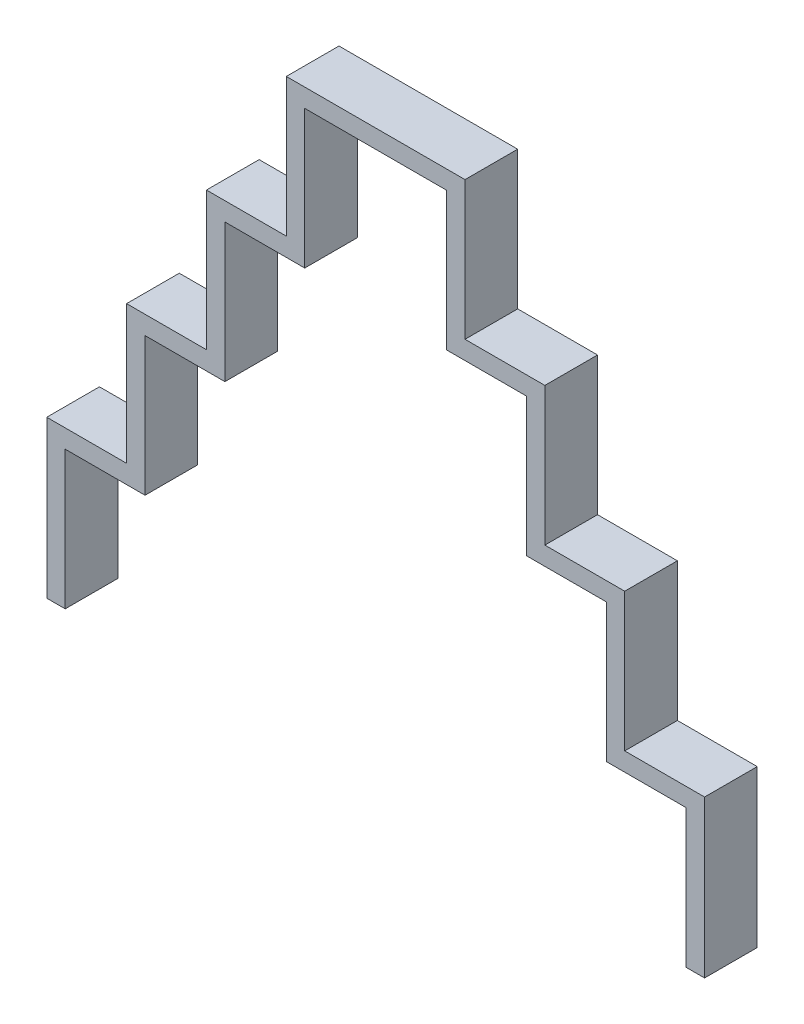
ISO-10303-21;
HEADER;
FILE_DESCRIPTION(('STEP AP214'),'2;1');
FILE_NAME('part.step','',(''),(''),'','','');
FILE_SCHEMA(('AUTOMOTIVE_DESIGN { 1 0 10303 214 1 1 1 1 }'));
ENDSEC;
DATA;
#1=APPLICATION_CONTEXT('core data for automotive mechanical design processes');
#2=APPLICATION_PROTOCOL_DEFINITION('international standard','automotive_design',2000,#1);
#3=PRODUCT_CONTEXT('',#1,'mechanical');
#4=PRODUCT('Part','Part','',(#3));
#5=PRODUCT_RELATED_PRODUCT_CATEGORY('part','',(#4));
#6=PRODUCT_DEFINITION_FORMATION('','',#4);
#7=PRODUCT_DEFINITION_CONTEXT('part definition',#1,'design');
#8=PRODUCT_DEFINITION('design','',#6,#7);
#9=PRODUCT_DEFINITION_SHAPE('','',#8);
#10=(LENGTH_UNIT() NAMED_UNIT(*) SI_UNIT(.MILLI.,.METRE.));
#11=(NAMED_UNIT(*) PLANE_ANGLE_UNIT() SI_UNIT($,.RADIAN.));
#12=(NAMED_UNIT(*) SI_UNIT($,.STERADIAN.) SOLID_ANGLE_UNIT());
#13=UNCERTAINTY_MEASURE_WITH_UNIT(LENGTH_MEASURE(1.E-05),#10,'distance_accuracy_value','');
#14=(GEOMETRIC_REPRESENTATION_CONTEXT(3) GLOBAL_UNCERTAINTY_ASSIGNED_CONTEXT((#13)) GLOBAL_UNIT_ASSIGNED_CONTEXT((#10,
#11,#12)) REPRESENTATION_CONTEXT('',''));
#15=CARTESIAN_POINT('',(0.,0.,0.));
#16=DIRECTION('',(0.,0.,1.));
#17=DIRECTION('',(1.,0.,0.));
#18=AXIS2_PLACEMENT_3D('',#15,#16,#17);
#19=CARTESIAN_POINT('',(-12.485,0.,2.));
#20=DIRECTION('',(0.,1.,0.));
#21=DIRECTION('',(0.,0.,1.));
#22=AXIS2_PLACEMENT_3D('',#19,#20,#21);
#23=PLANE('',#22);
#24=DIRECTION('',(1.,0.,0.));
#25=VECTOR('',#24,1.);
#26=CARTESIAN_POINT('',(-12.485,0.,0.));
#27=LINE('',#26,#25);
#28=CARTESIAN_POINT('',(-12.485,0.,0.));
#29=VERTEX_POINT('',#28);
#30=CARTESIAN_POINT('',(-11.785,0.,0.));
#31=VERTEX_POINT('',#30);
#32=EDGE_CURVE('E275',#29,#31,#27,.T.);
#33=ORIENTED_EDGE('',*,*,#32,.T.);
#34=DIRECTION('',(0.,0.,-1.));
#35=VECTOR('',#34,1.);
#36=CARTESIAN_POINT('',(-11.785,0.,2.));
#37=LINE('',#36,#35);
#38=CARTESIAN_POINT('',(-11.785,0.,2.));
#39=VERTEX_POINT('',#38);
#40=EDGE_CURVE('E11',#39,#31,#37,.T.);
#41=ORIENTED_EDGE('',*,*,#40,.F.);
#42=DIRECTION('',(1.,0.,0.));
#43=VECTOR('',#42,1.);
#44=CARTESIAN_POINT('',(-12.485,0.,2.));
#45=LINE('',#44,#43);
#46=CARTESIAN_POINT('',(-12.485,0.,2.));
#47=VERTEX_POINT('',#46);
#48=EDGE_CURVE('E337',#47,#39,#45,.T.);
#49=ORIENTED_EDGE('',*,*,#48,.F.);
#50=DIRECTION('',(0.,0.,-1.));
#51=VECTOR('',#50,1.);
#52=CARTESIAN_POINT('',(-12.485,0.,2.));
#53=LINE('',#52,#51);
#54=EDGE_CURVE('E271',#47,#29,#53,.T.);
#55=ORIENTED_EDGE('',*,*,#54,.T.);
#56=EDGE_LOOP('',(#33,#41,#49,#55));
#57=FACE_BOUND('',#56,.T.);
#58=ADVANCED_FACE('F35',(#57),#23,.F.);
#59=CARTESIAN_POINT('',(-11.785,5.25,2.));
#60=DIRECTION('',(-1.,0.,0.));
#61=DIRECTION('',(0.,0.,1.));
#62=AXIS2_PLACEMENT_3D('',#59,#60,#61);
#63=PLANE('',#62);
#64=DIRECTION('',(0.,1.,0.));
#65=VECTOR('',#64,1.);
#66=CARTESIAN_POINT('',(-11.785,5.25,0.));
#67=LINE('',#66,#65);
#68=CARTESIAN_POINT('',(-11.785,5.25,0.));
#69=VERTEX_POINT('',#68);
#70=EDGE_CURVE('E278',#31,#69,#67,.T.);
#71=ORIENTED_EDGE('',*,*,#70,.T.);
#72=DIRECTION('',(0.,0.,-1.));
#73=VECTOR('',#72,1.);
#74=CARTESIAN_POINT('',(-11.785,5.25,2.));
#75=LINE('',#74,#73);
#76=CARTESIAN_POINT('',(-11.785,5.25,2.));
#77=VERTEX_POINT('',#76);
#78=EDGE_CURVE('E43',#77,#69,#75,.T.);
#79=ORIENTED_EDGE('',*,*,#78,.F.);
#80=DIRECTION('',(0.,1.,0.));
#81=VECTOR('',#80,1.);
#82=CARTESIAN_POINT('',(-11.785,5.25,2.));
#83=LINE('',#82,#81);
#84=EDGE_CURVE('E166',#39,#77,#83,.T.);
#85=ORIENTED_EDGE('',*,*,#84,.F.);
#86=ORIENTED_EDGE('',*,*,#40,.T.);
#87=EDGE_LOOP('',(#71,#79,#85,#86));
#88=FACE_BOUND('',#87,.T.);
#89=ADVANCED_FACE('F515',(#88),#63,.F.);
#90=CARTESIAN_POINT('',(-8.75391108675444,5.25,2.));
#91=DIRECTION('',(0.,1.,0.));
#92=DIRECTION('',(-1.,0.,0.));
#93=AXIS2_PLACEMENT_3D('',#90,#91,#92);
#94=PLANE('',#93);
#95=DIRECTION('',(1.,0.,0.));
#96=VECTOR('',#95,1.);
#97=CARTESIAN_POINT('',(-8.75391108675444,5.25,0.));
#98=LINE('',#97,#96);
#99=CARTESIAN_POINT('',(-8.75391108675444,5.25,0.));
#100=VERTEX_POINT('',#99);
#101=EDGE_CURVE('E280',#69,#100,#98,.T.);
#102=ORIENTED_EDGE('',*,*,#101,.T.);
#103=DIRECTION('',(0.,0.,-1.));
#104=VECTOR('',#103,1.);
#105=CARTESIAN_POINT('',(-8.75391108675444,5.25,2.));
#106=LINE('',#105,#104);
#107=CARTESIAN_POINT('',(-8.75391108675444,5.25,2.));
#108=VERTEX_POINT('',#107);
#109=EDGE_CURVE('E416',#108,#100,#106,.T.);
#110=ORIENTED_EDGE('',*,*,#109,.F.);
#111=DIRECTION('',(1.,0.,0.));
#112=VECTOR('',#111,1.);
#113=CARTESIAN_POINT('',(-8.75391108675444,5.25,2.));
#114=LINE('',#113,#112);
#115=EDGE_CURVE('E424',#77,#108,#114,.T.);
#116=ORIENTED_EDGE('',*,*,#115,.F.);
#117=ORIENTED_EDGE('',*,*,#78,.T.);
#118=EDGE_LOOP('',(#102,#110,#116,#117));
#119=FACE_BOUND('',#118,.T.);
#120=ADVANCED_FACE('F422',(#119),#94,.F.);
#121=CARTESIAN_POINT('',(-8.75391108675444,10.5,2.));
#122=DIRECTION('',(-1.,0.,0.));
#123=DIRECTION('',(0.,-1.,0.));
#124=AXIS2_PLACEMENT_3D('',#121,#122,#123);
#125=PLANE('',#124);
#126=DIRECTION('',(0.,1.,0.));
#127=VECTOR('',#126,1.);
#128=CARTESIAN_POINT('',(-8.75391108675444,10.5,0.));
#129=LINE('',#128,#127);
#130=CARTESIAN_POINT('',(-8.75391108675444,10.5,0.));
#131=VERTEX_POINT('',#130);
#132=EDGE_CURVE('E282',#100,#131,#129,.T.);
#133=ORIENTED_EDGE('',*,*,#132,.T.);
#134=DIRECTION('',(0.,0.,-1.));
#135=VECTOR('',#134,1.);
#136=CARTESIAN_POINT('',(-8.75391108675444,10.5,2.));
#137=LINE('',#136,#135);
#138=CARTESIAN_POINT('',(-8.75391108675444,10.5,2.));
#139=VERTEX_POINT('',#138);
#140=EDGE_CURVE('E413',#139,#131,#137,.T.);
#141=ORIENTED_EDGE('',*,*,#140,.F.);
#142=DIRECTION('',(0.,1.,0.));
#143=VECTOR('',#142,1.);
#144=CARTESIAN_POINT('',(-8.75391108675444,10.5,2.));
#145=LINE('',#144,#143);
#146=EDGE_CURVE('E442',#108,#139,#145,.T.);
#147=ORIENTED_EDGE('',*,*,#146,.F.);
#148=ORIENTED_EDGE('',*,*,#109,.T.);
#149=EDGE_LOOP('',(#133,#141,#147,#148));
#150=FACE_BOUND('',#149,.T.);
#151=ADVANCED_FACE('F433',(#150),#125,.F.);
#152=CARTESIAN_POINT('',(-5.72282217350887,10.5,2.));
#153=DIRECTION('',(0.,1.,0.));
#154=DIRECTION('',(0.,0.,1.));
#155=AXIS2_PLACEMENT_3D('',#152,#153,#154);
#156=PLANE('',#155);
#157=DIRECTION('',(1.,0.,0.));
#158=VECTOR('',#157,1.);
#159=CARTESIAN_POINT('',(-5.72282217350887,10.5,0.));
#160=LINE('',#159,#158);
#161=CARTESIAN_POINT('',(-5.72282217350887,10.5,0.));
#162=VERTEX_POINT('',#161);
#163=EDGE_CURVE('E284',#131,#162,#160,.T.);
#164=ORIENTED_EDGE('',*,*,#163,.T.);
#165=DIRECTION('',(0.,0.,-1.));
#166=VECTOR('',#165,1.);
#167=CARTESIAN_POINT('',(-5.72282217350887,10.5,2.));
#168=LINE('',#167,#166);
#169=CARTESIAN_POINT('',(-5.72282217350887,10.5,2.));
#170=VERTEX_POINT('',#169);
#171=EDGE_CURVE('E410',#170,#162,#168,.T.);
#172=ORIENTED_EDGE('',*,*,#171,.F.);
#173=DIRECTION('',(1.,0.,0.));
#174=VECTOR('',#173,1.);
#175=CARTESIAN_POINT('',(-5.72282217350887,10.5,2.));
#176=LINE('',#175,#174);
#177=EDGE_CURVE('E439',#139,#170,#176,.T.);
#178=ORIENTED_EDGE('',*,*,#177,.F.);
#179=ORIENTED_EDGE('',*,*,#140,.T.);
#180=EDGE_LOOP('',(#164,#172,#178,#179));
#181=FACE_BOUND('',#180,.T.);
#182=ADVANCED_FACE('F437',(#181),#156,.F.);
#183=CARTESIAN_POINT('',(-5.72282217350887,15.75,2.));
#184=DIRECTION('',(-1.,0.,0.));
#185=DIRECTION('',(0.,0.,1.));
#186=AXIS2_PLACEMENT_3D('',#183,#184,#185);
#187=PLANE('',#186);
#188=DIRECTION('',(0.,1.,0.));
#189=VECTOR('',#188,1.);
#190=CARTESIAN_POINT('',(-5.72282217350887,15.75,0.));
#191=LINE('',#190,#189);
#192=CARTESIAN_POINT('',(-5.72282217350887,15.75,0.));
#193=VERTEX_POINT('',#192);
#194=EDGE_CURVE('E286',#162,#193,#191,.T.);
#195=ORIENTED_EDGE('',*,*,#194,.T.);
#196=DIRECTION('',(0.,0.,-1.));
#197=VECTOR('',#196,1.);
#198=CARTESIAN_POINT('',(-5.72282217350887,15.75,2.));
#199=LINE('',#198,#197);
#200=CARTESIAN_POINT('',(-5.72282217350887,15.75,2.));
#201=VERTEX_POINT('',#200);
#202=EDGE_CURVE('E407',#201,#193,#199,.T.);
#203=ORIENTED_EDGE('',*,*,#202,.F.);
#204=DIRECTION('',(0.,1.,0.));
#205=VECTOR('',#204,1.);
#206=CARTESIAN_POINT('',(-5.72282217350887,15.75,2.));
#207=LINE('',#206,#205);
#208=EDGE_CURVE('E441',#170,#201,#207,.T.);
#209=ORIENTED_EDGE('',*,*,#208,.F.);
#210=ORIENTED_EDGE('',*,*,#171,.T.);
#211=EDGE_LOOP('',(#195,#203,#209,#210));
#212=FACE_BOUND('',#211,.T.);
#213=ADVANCED_FACE('F528',(#212),#187,.F.);
#214=CARTESIAN_POINT('',(-2.6917332602633,15.75,2.));
#215=DIRECTION('',(0.,1.,0.));
#216=DIRECTION('',(0.,0.,1.));
#217=AXIS2_PLACEMENT_3D('',#214,#215,#216);
#218=PLANE('',#217);
#219=DIRECTION('',(1.,0.,0.));
#220=VECTOR('',#219,1.);
#221=CARTESIAN_POINT('',(-2.6917332602633,15.75,0.));
#222=LINE('',#221,#220);
#223=CARTESIAN_POINT('',(-2.6917332602633,15.75,0.));
#224=VERTEX_POINT('',#223);
#225=EDGE_CURVE('E288',#193,#224,#222,.T.);
#226=ORIENTED_EDGE('',*,*,#225,.T.);
#227=DIRECTION('',(0.,0.,-1.));
#228=VECTOR('',#227,1.);
#229=CARTESIAN_POINT('',(-2.6917332602633,15.75,2.));
#230=LINE('',#229,#228);
#231=CARTESIAN_POINT('',(-2.6917332602633,15.75,2.));
#232=VERTEX_POINT('',#231);
#233=EDGE_CURVE('E404',#232,#224,#230,.T.);
#234=ORIENTED_EDGE('',*,*,#233,.F.);
#235=DIRECTION('',(1.,0.,0.));
#236=VECTOR('',#235,1.);
#237=CARTESIAN_POINT('',(-2.6917332602633,15.75,2.));
#238=LINE('',#237,#236);
#239=EDGE_CURVE('E444',#201,#232,#238,.T.);
#240=ORIENTED_EDGE('',*,*,#239,.F.);
#241=ORIENTED_EDGE('',*,*,#202,.T.);
#242=EDGE_LOOP('',(#226,#234,#240,#241));
#243=FACE_BOUND('',#242,.T.);
#244=ADVANCED_FACE('F531',(#243),#218,.F.);
#245=CARTESIAN_POINT('',(-2.6917332602633,21.,2.));
#246=DIRECTION('',(-1.,0.,0.));
#247=DIRECTION('',(0.,-1.,0.));
#248=AXIS2_PLACEMENT_3D('',#245,#246,#247);
#249=PLANE('',#248);
#250=DIRECTION('',(0.,1.,0.));
#251=VECTOR('',#250,1.);
#252=CARTESIAN_POINT('',(-2.6917332602633,21.,0.));
#253=LINE('',#252,#251);
#254=CARTESIAN_POINT('',(-2.6917332602633,21.,0.));
#255=VERTEX_POINT('',#254);
#256=EDGE_CURVE('E290',#224,#255,#253,.T.);
#257=ORIENTED_EDGE('',*,*,#256,.T.);
#258=DIRECTION('',(0.,0.,-1.));
#259=VECTOR('',#258,1.);
#260=CARTESIAN_POINT('',(-2.6917332602633,21.,2.));
#261=LINE('',#260,#259);
#262=CARTESIAN_POINT('',(-2.6917332602633,21.,2.));
#263=VERTEX_POINT('',#262);
#264=EDGE_CURVE('E401',#263,#255,#261,.T.);
#265=ORIENTED_EDGE('',*,*,#264,.F.);
#266=DIRECTION('',(0.,1.,0.));
#267=VECTOR('',#266,1.);
#268=CARTESIAN_POINT('',(-2.6917332602633,21.,2.));
#269=LINE('',#268,#267);
#270=EDGE_CURVE('E450',#232,#263,#269,.T.);
#271=ORIENTED_EDGE('',*,*,#270,.F.);
#272=ORIENTED_EDGE('',*,*,#233,.T.);
#273=EDGE_LOOP('',(#257,#265,#271,#272));
#274=FACE_BOUND('',#273,.T.);
#275=ADVANCED_FACE('F535',(#274),#249,.F.);
#276=CARTESIAN_POINT('',(-2.6917332602633,21.,2.));
#277=DIRECTION('',(0.,1.,0.));
#278=DIRECTION('',(0.,0.,1.));
#279=AXIS2_PLACEMENT_3D('',#276,#277,#278);
#280=PLANE('',#279);
#281=DIRECTION('',(1.,0.,0.));
#282=VECTOR('',#281,1.);
#283=CARTESIAN_POINT('',(-2.6917332602633,21.,0.));
#284=LINE('',#283,#282);
#285=CARTESIAN_POINT('',(2.6917332602633,21.,0.));
#286=VERTEX_POINT('',#285);
#287=EDGE_CURVE('E292',#255,#286,#284,.T.);
#288=ORIENTED_EDGE('',*,*,#287,.T.);
#289=DIRECTION('',(0.,0.,-1.));
#290=VECTOR('',#289,1.);
#291=CARTESIAN_POINT('',(2.6917332602633,21.,2.));
#292=LINE('',#291,#290);
#293=CARTESIAN_POINT('',(2.6917332602633,21.,2.));
#294=VERTEX_POINT('',#293);
#295=EDGE_CURVE('E398',#294,#286,#292,.T.);
#296=ORIENTED_EDGE('',*,*,#295,.F.);
#297=DIRECTION('',(1.,0.,0.));
#298=VECTOR('',#297,1.);
#299=CARTESIAN_POINT('',(-2.6917332602633,21.,2.));
#300=LINE('',#299,#298);
#301=EDGE_CURVE('E452',#263,#294,#300,.T.);
#302=ORIENTED_EDGE('',*,*,#301,.F.);
#303=ORIENTED_EDGE('',*,*,#264,.T.);
#304=EDGE_LOOP('',(#288,#296,#302,#303));
#305=FACE_BOUND('',#304,.T.);
#306=ADVANCED_FACE('F539',(#305),#280,.F.);
#307=CARTESIAN_POINT('',(2.6917332602633,21.,2.));
#308=DIRECTION('',(1.,0.,0.));
#309=DIRECTION('',(0.,1.,0.));
#310=AXIS2_PLACEMENT_3D('',#307,#308,#309);
#311=PLANE('',#310);
#312=DIRECTION('',(0.,-1.,0.));
#313=VECTOR('',#312,1.);
#314=CARTESIAN_POINT('',(2.6917332602633,21.,0.));
#315=LINE('',#314,#313);
#316=CARTESIAN_POINT('',(2.6917332602633,15.75,0.));
#317=VERTEX_POINT('',#316);
#318=EDGE_CURVE('E294',#286,#317,#315,.T.);
#319=ORIENTED_EDGE('',*,*,#318,.T.);
#320=DIRECTION('',(0.,0.,-1.));
#321=VECTOR('',#320,1.);
#322=CARTESIAN_POINT('',(2.6917332602633,15.75,2.));
#323=LINE('',#322,#321);
#324=CARTESIAN_POINT('',(2.6917332602633,15.75,2.));
#325=VERTEX_POINT('',#324);
#326=EDGE_CURVE('E395',#325,#317,#323,.T.);
#327=ORIENTED_EDGE('',*,*,#326,.F.);
#328=DIRECTION('',(0.,-1.,0.));
#329=VECTOR('',#328,1.);
#330=CARTESIAN_POINT('',(2.6917332602633,21.,2.));
#331=LINE('',#330,#329);
#332=EDGE_CURVE('E454',#294,#325,#331,.T.);
#333=ORIENTED_EDGE('',*,*,#332,.F.);
#334=ORIENTED_EDGE('',*,*,#295,.T.);
#335=EDGE_LOOP('',(#319,#327,#333,#334));
#336=FACE_BOUND('',#335,.T.);
#337=ADVANCED_FACE('F543',(#336),#311,.F.);
#338=CARTESIAN_POINT('',(2.6917332602633,15.75,2.));
#339=DIRECTION('',(0.,1.,0.));
#340=DIRECTION('',(0.,0.,1.));
#341=AXIS2_PLACEMENT_3D('',#338,#339,#340);
#342=PLANE('',#341);
#343=DIRECTION('',(1.,0.,0.));
#344=VECTOR('',#343,1.);
#345=CARTESIAN_POINT('',(2.6917332602633,15.75,0.));
#346=LINE('',#345,#344);
#347=CARTESIAN_POINT('',(5.72282217350887,15.75,0.));
#348=VERTEX_POINT('',#347);
#349=EDGE_CURVE('E296',#317,#348,#346,.T.);
#350=ORIENTED_EDGE('',*,*,#349,.T.);
#351=DIRECTION('',(0.,0.,-1.));
#352=VECTOR('',#351,1.);
#353=CARTESIAN_POINT('',(5.72282217350887,15.75,2.));
#354=LINE('',#353,#352);
#355=CARTESIAN_POINT('',(5.72282217350887,15.75,2.));
#356=VERTEX_POINT('',#355);
#357=EDGE_CURVE('E392',#356,#348,#354,.T.);
#358=ORIENTED_EDGE('',*,*,#357,.F.);
#359=DIRECTION('',(1.,0.,0.));
#360=VECTOR('',#359,1.);
#361=CARTESIAN_POINT('',(2.6917332602633,15.75,2.));
#362=LINE('',#361,#360);
#363=EDGE_CURVE('E456',#325,#356,#362,.T.);
#364=ORIENTED_EDGE('',*,*,#363,.F.);
#365=ORIENTED_EDGE('',*,*,#326,.T.);
#366=EDGE_LOOP('',(#350,#358,#364,#365));
#367=FACE_BOUND('',#366,.T.);
#368=ADVANCED_FACE('F547',(#367),#342,.F.);
#369=CARTESIAN_POINT('',(5.72282217350887,15.75,2.));
#370=DIRECTION('',(1.,0.,0.));
#371=DIRECTION('',(0.,0.,-1.));
#372=AXIS2_PLACEMENT_3D('',#369,#370,#371);
#373=PLANE('',#372);
#374=DIRECTION('',(0.,-1.,0.));
#375=VECTOR('',#374,1.);
#376=CARTESIAN_POINT('',(5.72282217350887,15.75,0.));
#377=LINE('',#376,#375);
#378=CARTESIAN_POINT('',(5.72282217350887,10.5,0.));
#379=VERTEX_POINT('',#378);
#380=EDGE_CURVE('E298',#348,#379,#377,.T.);
#381=ORIENTED_EDGE('',*,*,#380,.T.);
#382=DIRECTION('',(0.,0.,-1.));
#383=VECTOR('',#382,1.);
#384=CARTESIAN_POINT('',(5.72282217350887,10.5,2.));
#385=LINE('',#384,#383);
#386=CARTESIAN_POINT('',(5.72282217350887,10.5,2.));
#387=VERTEX_POINT('',#386);
#388=EDGE_CURVE('E389',#387,#379,#385,.T.);
#389=ORIENTED_EDGE('',*,*,#388,.F.);
#390=DIRECTION('',(0.,-1.,0.));
#391=VECTOR('',#390,1.);
#392=CARTESIAN_POINT('',(5.72282217350887,15.75,2.));
#393=LINE('',#392,#391);
#394=EDGE_CURVE('E458',#356,#387,#393,.T.);
#395=ORIENTED_EDGE('',*,*,#394,.F.);
#396=ORIENTED_EDGE('',*,*,#357,.T.);
#397=EDGE_LOOP('',(#381,#389,#395,#396));
#398=FACE_BOUND('',#397,.T.);
#399=ADVANCED_FACE('F551',(#398),#373,.F.);
#400=CARTESIAN_POINT('',(5.72282217350887,10.5,2.));
#401=DIRECTION('',(0.,1.,0.));
#402=DIRECTION('',(0.,0.,1.));
#403=AXIS2_PLACEMENT_3D('',#400,#401,#402);
#404=PLANE('',#403);
#405=DIRECTION('',(1.,0.,0.));
#406=VECTOR('',#405,1.);
#407=CARTESIAN_POINT('',(5.72282217350887,10.5,0.));
#408=LINE('',#407,#406);
#409=CARTESIAN_POINT('',(8.75391108675444,10.5,0.));
#410=VERTEX_POINT('',#409);
#411=EDGE_CURVE('E300',#379,#410,#408,.T.);
#412=ORIENTED_EDGE('',*,*,#411,.T.);
#413=DIRECTION('',(0.,0.,-1.));
#414=VECTOR('',#413,1.);
#415=CARTESIAN_POINT('',(8.75391108675444,10.5,2.));
#416=LINE('',#415,#414);
#417=CARTESIAN_POINT('',(8.75391108675444,10.5,2.));
#418=VERTEX_POINT('',#417);
#419=EDGE_CURVE('E386',#418,#410,#416,.T.);
#420=ORIENTED_EDGE('',*,*,#419,.F.);
#421=DIRECTION('',(1.,0.,0.));
#422=VECTOR('',#421,1.);
#423=CARTESIAN_POINT('',(5.72282217350887,10.5,2.));
#424=LINE('',#423,#422);
#425=EDGE_CURVE('E460',#387,#418,#424,.T.);
#426=ORIENTED_EDGE('',*,*,#425,.F.);
#427=ORIENTED_EDGE('',*,*,#388,.T.);
#428=EDGE_LOOP('',(#412,#420,#426,#427));
#429=FACE_BOUND('',#428,.T.);
#430=ADVANCED_FACE('F555',(#429),#404,.F.);
#431=CARTESIAN_POINT('',(8.75391108675444,10.5,2.));
#432=DIRECTION('',(1.,0.,0.));
#433=DIRECTION('',(0.,1.,0.));
#434=AXIS2_PLACEMENT_3D('',#431,#432,#433);
#435=PLANE('',#434);
#436=DIRECTION('',(0.,-1.,0.));
#437=VECTOR('',#436,1.);
#438=CARTESIAN_POINT('',(8.75391108675444,10.5,0.));
#439=LINE('',#438,#437);
#440=CARTESIAN_POINT('',(8.75391108675444,5.25,0.));
#441=VERTEX_POINT('',#440);
#442=EDGE_CURVE('E302',#410,#441,#439,.T.);
#443=ORIENTED_EDGE('',*,*,#442,.T.);
#444=DIRECTION('',(0.,0.,-1.));
#445=VECTOR('',#444,1.);
#446=CARTESIAN_POINT('',(8.75391108675444,5.25,2.));
#447=LINE('',#446,#445);
#448=CARTESIAN_POINT('',(8.75391108675444,5.25,2.));
#449=VERTEX_POINT('',#448);
#450=EDGE_CURVE('E383',#449,#441,#447,.T.);
#451=ORIENTED_EDGE('',*,*,#450,.F.);
#452=DIRECTION('',(0.,-1.,0.));
#453=VECTOR('',#452,1.);
#454=CARTESIAN_POINT('',(8.75391108675444,10.5,2.));
#455=LINE('',#454,#453);
#456=EDGE_CURVE('E462',#418,#449,#455,.T.);
#457=ORIENTED_EDGE('',*,*,#456,.F.);
#458=ORIENTED_EDGE('',*,*,#419,.T.);
#459=EDGE_LOOP('',(#443,#451,#457,#458));
#460=FACE_BOUND('',#459,.T.);
#461=ADVANCED_FACE('F559',(#460),#435,.F.);
#462=CARTESIAN_POINT('',(8.75391108675444,5.25,2.));
#463=DIRECTION('',(0.,1.,0.));
#464=DIRECTION('',(-1.,0.,0.));
#465=AXIS2_PLACEMENT_3D('',#462,#463,#464);
#466=PLANE('',#465);
#467=DIRECTION('',(1.,0.,0.));
#468=VECTOR('',#467,1.);
#469=CARTESIAN_POINT('',(8.75391108675444,5.25,0.));
#470=LINE('',#469,#468);
#471=CARTESIAN_POINT('',(11.785,5.25,0.));
#472=VERTEX_POINT('',#471);
#473=EDGE_CURVE('E304',#441,#472,#470,.T.);
#474=ORIENTED_EDGE('',*,*,#473,.T.);
#475=DIRECTION('',(0.,0.,-1.));
#476=VECTOR('',#475,1.);
#477=CARTESIAN_POINT('',(11.785,5.25,2.));
#478=LINE('',#477,#476);
#479=CARTESIAN_POINT('',(11.785,5.25,2.));
#480=VERTEX_POINT('',#479);
#481=EDGE_CURVE('E380',#480,#472,#478,.T.);
#482=ORIENTED_EDGE('',*,*,#481,.F.);
#483=DIRECTION('',(1.,0.,0.));
#484=VECTOR('',#483,1.);
#485=CARTESIAN_POINT('',(8.75391108675444,5.25,2.));
#486=LINE('',#485,#484);
#487=EDGE_CURVE('E464',#449,#480,#486,.T.);
#488=ORIENTED_EDGE('',*,*,#487,.F.);
#489=ORIENTED_EDGE('',*,*,#450,.T.);
#490=EDGE_LOOP('',(#474,#482,#488,#489));
#491=FACE_BOUND('',#490,.T.);
#492=ADVANCED_FACE('F563',(#491),#466,.F.);
#493=CARTESIAN_POINT('',(11.785,5.25,2.));
#494=DIRECTION('',(1.,0.,0.));
#495=DIRECTION('',(0.,1.,0.));
#496=AXIS2_PLACEMENT_3D('',#493,#494,#495);
#497=PLANE('',#496);
#498=DIRECTION('',(0.,-1.,0.));
#499=VECTOR('',#498,1.);
#500=CARTESIAN_POINT('',(11.785,5.25,0.));
#501=LINE('',#500,#499);
#502=CARTESIAN_POINT('',(11.785,0.,0.));
#503=VERTEX_POINT('',#502);
#504=EDGE_CURVE('E306',#472,#503,#501,.T.);
#505=ORIENTED_EDGE('',*,*,#504,.T.);
#506=DIRECTION('',(0.,0.,-1.));
#507=VECTOR('',#506,1.);
#508=CARTESIAN_POINT('',(11.785,0.,2.));
#509=LINE('',#508,#507);
#510=CARTESIAN_POINT('',(11.785,0.,2.));
#511=VERTEX_POINT('',#510);
#512=EDGE_CURVE('E377',#511,#503,#509,.T.);
#513=ORIENTED_EDGE('',*,*,#512,.F.);
#514=DIRECTION('',(0.,-1.,0.));
#515=VECTOR('',#514,1.);
#516=CARTESIAN_POINT('',(11.785,5.25,2.));
#517=LINE('',#516,#515);
#518=EDGE_CURVE('E466',#480,#511,#517,.T.);
#519=ORIENTED_EDGE('',*,*,#518,.F.);
#520=ORIENTED_EDGE('',*,*,#481,.T.);
#521=EDGE_LOOP('',(#505,#513,#519,#520));
#522=FACE_BOUND('',#521,.T.);
#523=ADVANCED_FACE('F567',(#522),#497,.F.);
#524=CARTESIAN_POINT('',(11.785,0.,2.));
#525=DIRECTION('',(0.,1.,0.));
#526=DIRECTION('',(0.,0.,1.));
#527=AXIS2_PLACEMENT_3D('',#524,#525,#526);
#528=PLANE('',#527);
#529=DIRECTION('',(1.,0.,0.));
#530=VECTOR('',#529,1.);
#531=CARTESIAN_POINT('',(11.785,0.,0.));
#532=LINE('',#531,#530);
#533=CARTESIAN_POINT('',(12.485,0.,0.));
#534=VERTEX_POINT('',#533);
#535=EDGE_CURVE('E308',#503,#534,#532,.T.);
#536=ORIENTED_EDGE('',*,*,#535,.T.);
#537=DIRECTION('',(0.,0.,-1.));
#538=VECTOR('',#537,1.);
#539=CARTESIAN_POINT('',(12.485,0.,2.));
#540=LINE('',#539,#538);
#541=CARTESIAN_POINT('',(12.485,0.,2.));
#542=VERTEX_POINT('',#541);
#543=EDGE_CURVE('E374',#542,#534,#540,.T.);
#544=ORIENTED_EDGE('',*,*,#543,.F.);
#545=DIRECTION('',(1.,0.,0.));
#546=VECTOR('',#545,1.);
#547=CARTESIAN_POINT('',(11.785,0.,2.));
#548=LINE('',#547,#546);
#549=EDGE_CURVE('E468',#511,#542,#548,.T.);
#550=ORIENTED_EDGE('',*,*,#549,.F.);
#551=ORIENTED_EDGE('',*,*,#512,.T.);
#552=EDGE_LOOP('',(#536,#544,#550,#551));
#553=FACE_BOUND('',#552,.T.);
#554=ADVANCED_FACE('F571',(#553),#528,.F.);
#555=CARTESIAN_POINT('',(12.485,5.95,2.));
#556=DIRECTION('',(-1.,0.,0.));
#557=DIRECTION('',(0.,0.,1.));
#558=AXIS2_PLACEMENT_3D('',#555,#556,#557);
#559=PLANE('',#558);
#560=DIRECTION('',(0.,1.,0.));
#561=VECTOR('',#560,1.);
#562=CARTESIAN_POINT('',(12.485,5.95,0.));
#563=LINE('',#562,#561);
#564=CARTESIAN_POINT('',(12.485,5.95,0.));
#565=VERTEX_POINT('',#564);
#566=EDGE_CURVE('E310',#534,#565,#563,.T.);
#567=ORIENTED_EDGE('',*,*,#566,.T.);
#568=DIRECTION('',(0.,0.,-1.));
#569=VECTOR('',#568,1.);
#570=CARTESIAN_POINT('',(12.485,5.95,2.));
#571=LINE('',#570,#569);
#572=CARTESIAN_POINT('',(12.485,5.95,2.));
#573=VERTEX_POINT('',#572);
#574=EDGE_CURVE('E371',#573,#565,#571,.T.);
#575=ORIENTED_EDGE('',*,*,#574,.F.);
#576=DIRECTION('',(0.,1.,0.));
#577=VECTOR('',#576,1.);
#578=CARTESIAN_POINT('',(12.485,5.95,2.));
#579=LINE('',#578,#577);
#580=EDGE_CURVE('E470',#542,#573,#579,.T.);
#581=ORIENTED_EDGE('',*,*,#580,.F.);
#582=ORIENTED_EDGE('',*,*,#543,.T.);
#583=EDGE_LOOP('',(#567,#575,#581,#582));
#584=FACE_BOUND('',#583,.T.);
#585=ADVANCED_FACE('F575',(#584),#559,.F.);
#586=CARTESIAN_POINT('',(9.45391108675444,5.95,2.));
#587=DIRECTION('',(0.,-1.,0.));
#588=DIRECTION('',(0.,0.,-1.));
#589=AXIS2_PLACEMENT_3D('',#586,#587,#588);
#590=PLANE('',#589);
#591=DIRECTION('',(-1.,0.,0.));
#592=VECTOR('',#591,1.);
#593=CARTESIAN_POINT('',(9.45391108675444,5.95,0.));
#594=LINE('',#593,#592);
#595=CARTESIAN_POINT('',(9.45391108675444,5.95,0.));
#596=VERTEX_POINT('',#595);
#597=EDGE_CURVE('E312',#565,#596,#594,.T.);
#598=ORIENTED_EDGE('',*,*,#597,.T.);
#599=DIRECTION('',(0.,0.,-1.));
#600=VECTOR('',#599,1.);
#601=CARTESIAN_POINT('',(9.45391108675444,5.95,2.));
#602=LINE('',#601,#600);
#603=CARTESIAN_POINT('',(9.45391108675444,5.95,2.));
#604=VERTEX_POINT('',#603);
#605=EDGE_CURVE('E368',#604,#596,#602,.T.);
#606=ORIENTED_EDGE('',*,*,#605,.F.);
#607=DIRECTION('',(-1.,0.,0.));
#608=VECTOR('',#607,1.);
#609=CARTESIAN_POINT('',(9.45391108675444,5.95,2.));
#610=LINE('',#609,#608);
#611=EDGE_CURVE('E472',#573,#604,#610,.T.);
#612=ORIENTED_EDGE('',*,*,#611,.F.);
#613=ORIENTED_EDGE('',*,*,#574,.T.);
#614=EDGE_LOOP('',(#598,#606,#612,#613));
#615=FACE_BOUND('',#614,.T.);
#616=ADVANCED_FACE('F579',(#615),#590,.F.);
#617=CARTESIAN_POINT('',(9.45391108675444,11.2,2.));
#618=DIRECTION('',(-1.,0.,0.));
#619=DIRECTION('',(0.,0.,1.));
#620=AXIS2_PLACEMENT_3D('',#617,#618,#619);
#621=PLANE('',#620);
#622=DIRECTION('',(0.,1.,0.));
#623=VECTOR('',#622,1.);
#624=CARTESIAN_POINT('',(9.45391108675444,11.2,0.));
#625=LINE('',#624,#623);
#626=CARTESIAN_POINT('',(9.45391108675444,11.2,0.));
#627=VERTEX_POINT('',#626);
#628=EDGE_CURVE('E314',#596,#627,#625,.T.);
#629=ORIENTED_EDGE('',*,*,#628,.T.);
#630=DIRECTION('',(0.,0.,-1.));
#631=VECTOR('',#630,1.);
#632=CARTESIAN_POINT('',(9.45391108675444,11.2,2.));
#633=LINE('',#632,#631);
#634=CARTESIAN_POINT('',(9.45391108675444,11.2,2.));
#635=VERTEX_POINT('',#634);
#636=EDGE_CURVE('E365',#635,#627,#633,.T.);
#637=ORIENTED_EDGE('',*,*,#636,.F.);
#638=DIRECTION('',(0.,1.,0.));
#639=VECTOR('',#638,1.);
#640=CARTESIAN_POINT('',(9.45391108675444,11.2,2.));
#641=LINE('',#640,#639);
#642=EDGE_CURVE('E474',#604,#635,#641,.T.);
#643=ORIENTED_EDGE('',*,*,#642,.F.);
#644=ORIENTED_EDGE('',*,*,#605,.T.);
#645=EDGE_LOOP('',(#629,#637,#643,#644));
#646=FACE_BOUND('',#645,.T.);
#647=ADVANCED_FACE('F583',(#646),#621,.F.);
#648=CARTESIAN_POINT('',(6.42282217350887,11.2,2.));
#649=DIRECTION('',(0.,-1.,0.));
#650=DIRECTION('',(0.,0.,-1.));
#651=AXIS2_PLACEMENT_3D('',#648,#649,#650);
#652=PLANE('',#651);
#653=DIRECTION('',(-1.,0.,0.));
#654=VECTOR('',#653,1.);
#655=CARTESIAN_POINT('',(6.42282217350887,11.2,0.));
#656=LINE('',#655,#654);
#657=CARTESIAN_POINT('',(6.42282217350887,11.2,0.));
#658=VERTEX_POINT('',#657);
#659=EDGE_CURVE('E316',#627,#658,#656,.T.);
#660=ORIENTED_EDGE('',*,*,#659,.T.);
#661=DIRECTION('',(0.,0.,-1.));
#662=VECTOR('',#661,1.);
#663=CARTESIAN_POINT('',(6.42282217350887,11.2,2.));
#664=LINE('',#663,#662);
#665=CARTESIAN_POINT('',(6.42282217350887,11.2,2.));
#666=VERTEX_POINT('',#665);
#667=EDGE_CURVE('E362',#666,#658,#664,.T.);
#668=ORIENTED_EDGE('',*,*,#667,.F.);
#669=DIRECTION('',(-1.,0.,0.));
#670=VECTOR('',#669,1.);
#671=CARTESIAN_POINT('',(6.42282217350887,11.2,2.));
#672=LINE('',#671,#670);
#673=EDGE_CURVE('E476',#635,#666,#672,.T.);
#674=ORIENTED_EDGE('',*,*,#673,.F.);
#675=ORIENTED_EDGE('',*,*,#636,.T.);
#676=EDGE_LOOP('',(#660,#668,#674,#675));
#677=FACE_BOUND('',#676,.T.);
#678=ADVANCED_FACE('F587',(#677),#652,.F.);
#679=CARTESIAN_POINT('',(6.42282217350887,16.45,2.));
#680=DIRECTION('',(-1.,0.,0.));
#681=DIRECTION('',(0.,0.,1.));
#682=AXIS2_PLACEMENT_3D('',#679,#680,#681);
#683=PLANE('',#682);
#684=DIRECTION('',(0.,1.,0.));
#685=VECTOR('',#684,1.);
#686=CARTESIAN_POINT('',(6.42282217350887,16.45,0.));
#687=LINE('',#686,#685);
#688=CARTESIAN_POINT('',(6.42282217350887,16.45,0.));
#689=VERTEX_POINT('',#688);
#690=EDGE_CURVE('E318',#658,#689,#687,.T.);
#691=ORIENTED_EDGE('',*,*,#690,.T.);
#692=DIRECTION('',(0.,0.,-1.));
#693=VECTOR('',#692,1.);
#694=CARTESIAN_POINT('',(6.42282217350887,16.45,2.));
#695=LINE('',#694,#693);
#696=CARTESIAN_POINT('',(6.42282217350887,16.45,2.));
#697=VERTEX_POINT('',#696);
#698=EDGE_CURVE('E359',#697,#689,#695,.T.);
#699=ORIENTED_EDGE('',*,*,#698,.F.);
#700=DIRECTION('',(0.,1.,0.));
#701=VECTOR('',#700,1.);
#702=CARTESIAN_POINT('',(6.42282217350887,16.45,2.));
#703=LINE('',#702,#701);
#704=EDGE_CURVE('E478',#666,#697,#703,.T.);
#705=ORIENTED_EDGE('',*,*,#704,.F.);
#706=ORIENTED_EDGE('',*,*,#667,.T.);
#707=EDGE_LOOP('',(#691,#699,#705,#706));
#708=FACE_BOUND('',#707,.T.);
#709=ADVANCED_FACE('F591',(#708),#683,.F.);
#710=CARTESIAN_POINT('',(3.3917332602633,16.45,2.));
#711=DIRECTION('',(0.,-1.,0.));
#712=DIRECTION('',(0.,0.,-1.));
#713=AXIS2_PLACEMENT_3D('',#710,#711,#712);
#714=PLANE('',#713);
#715=DIRECTION('',(-1.,0.,0.));
#716=VECTOR('',#715,1.);
#717=CARTESIAN_POINT('',(3.3917332602633,16.45,0.));
#718=LINE('',#717,#716);
#719=CARTESIAN_POINT('',(3.3917332602633,16.45,0.));
#720=VERTEX_POINT('',#719);
#721=EDGE_CURVE('E320',#689,#720,#718,.T.);
#722=ORIENTED_EDGE('',*,*,#721,.T.);
#723=DIRECTION('',(0.,0.,-1.));
#724=VECTOR('',#723,1.);
#725=CARTESIAN_POINT('',(3.3917332602633,16.45,2.));
#726=LINE('',#725,#724);
#727=CARTESIAN_POINT('',(3.3917332602633,16.45,2.));
#728=VERTEX_POINT('',#727);
#729=EDGE_CURVE('E356',#728,#720,#726,.T.);
#730=ORIENTED_EDGE('',*,*,#729,.F.);
#731=DIRECTION('',(-1.,0.,0.));
#732=VECTOR('',#731,1.);
#733=CARTESIAN_POINT('',(3.3917332602633,16.45,2.));
#734=LINE('',#733,#732);
#735=EDGE_CURVE('E480',#697,#728,#734,.T.);
#736=ORIENTED_EDGE('',*,*,#735,.F.);
#737=ORIENTED_EDGE('',*,*,#698,.T.);
#738=EDGE_LOOP('',(#722,#730,#736,#737));
#739=FACE_BOUND('',#738,.T.);
#740=ADVANCED_FACE('F595',(#739),#714,.F.);
#741=CARTESIAN_POINT('',(3.3917332602633,21.7,2.));
#742=DIRECTION('',(-1.,0.,0.));
#743=DIRECTION('',(0.,0.,1.));
#744=AXIS2_PLACEMENT_3D('',#741,#742,#743);
#745=PLANE('',#744);
#746=DIRECTION('',(0.,1.,0.));
#747=VECTOR('',#746,1.);
#748=CARTESIAN_POINT('',(3.3917332602633,21.7,0.));
#749=LINE('',#748,#747);
#750=CARTESIAN_POINT('',(3.3917332602633,21.7,0.));
#751=VERTEX_POINT('',#750);
#752=EDGE_CURVE('E322',#720,#751,#749,.T.);
#753=ORIENTED_EDGE('',*,*,#752,.T.);
#754=DIRECTION('',(0.,0.,-1.));
#755=VECTOR('',#754,1.);
#756=CARTESIAN_POINT('',(3.3917332602633,21.7,2.));
#757=LINE('',#756,#755);
#758=CARTESIAN_POINT('',(3.3917332602633,21.7,2.));
#759=VERTEX_POINT('',#758);
#760=EDGE_CURVE('E353',#759,#751,#757,.T.);
#761=ORIENTED_EDGE('',*,*,#760,.F.);
#762=DIRECTION('',(0.,1.,0.));
#763=VECTOR('',#762,1.);
#764=CARTESIAN_POINT('',(3.3917332602633,21.7,2.));
#765=LINE('',#764,#763);
#766=EDGE_CURVE('E482',#728,#759,#765,.T.);
#767=ORIENTED_EDGE('',*,*,#766,.F.);
#768=ORIENTED_EDGE('',*,*,#729,.T.);
#769=EDGE_LOOP('',(#753,#761,#767,#768));
#770=FACE_BOUND('',#769,.T.);
#771=ADVANCED_FACE('F599',(#770),#745,.F.);
#772=CARTESIAN_POINT('',(-3.3917332602633,21.7,2.));
#773=DIRECTION('',(0.,-1.,0.));
#774=DIRECTION('',(0.,0.,-1.));
#775=AXIS2_PLACEMENT_3D('',#772,#773,#774);
#776=PLANE('',#775);
#777=DIRECTION('',(-1.,0.,0.));
#778=VECTOR('',#777,1.);
#779=CARTESIAN_POINT('',(-3.3917332602633,21.7,0.));
#780=LINE('',#779,#778);
#781=CARTESIAN_POINT('',(-3.3917332602633,21.7,0.));
#782=VERTEX_POINT('',#781);
#783=EDGE_CURVE('E324',#751,#782,#780,.T.);
#784=ORIENTED_EDGE('',*,*,#783,.T.);
#785=DIRECTION('',(0.,0.,-1.));
#786=VECTOR('',#785,1.);
#787=CARTESIAN_POINT('',(-3.3917332602633,21.7,2.));
#788=LINE('',#787,#786);
#789=CARTESIAN_POINT('',(-3.3917332602633,21.7,2.));
#790=VERTEX_POINT('',#789);
#791=EDGE_CURVE('E350',#790,#782,#788,.T.);
#792=ORIENTED_EDGE('',*,*,#791,.F.);
#793=DIRECTION('',(-1.,0.,0.));
#794=VECTOR('',#793,1.);
#795=CARTESIAN_POINT('',(-3.3917332602633,21.7,2.));
#796=LINE('',#795,#794);
#797=EDGE_CURVE('E484',#759,#790,#796,.T.);
#798=ORIENTED_EDGE('',*,*,#797,.F.);
#799=ORIENTED_EDGE('',*,*,#760,.T.);
#800=EDGE_LOOP('',(#784,#792,#798,#799));
#801=FACE_BOUND('',#800,.T.);
#802=ADVANCED_FACE('F603',(#801),#776,.F.);
#803=CARTESIAN_POINT('',(-3.3917332602633,21.7,2.));
#804=DIRECTION('',(1.,0.,0.));
#805=DIRECTION('',(0.,0.,-1.));
#806=AXIS2_PLACEMENT_3D('',#803,#804,#805);
#807=PLANE('',#806);
#808=DIRECTION('',(0.,-1.,0.));
#809=VECTOR('',#808,1.);
#810=CARTESIAN_POINT('',(-3.3917332602633,21.7,0.));
#811=LINE('',#810,#809);
#812=CARTESIAN_POINT('',(-3.3917332602633,16.45,0.));
#813=VERTEX_POINT('',#812);
#814=EDGE_CURVE('E326',#782,#813,#811,.T.);
#815=ORIENTED_EDGE('',*,*,#814,.T.);
#816=DIRECTION('',(0.,0.,-1.));
#817=VECTOR('',#816,1.);
#818=CARTESIAN_POINT('',(-3.3917332602633,16.45,2.));
#819=LINE('',#818,#817);
#820=CARTESIAN_POINT('',(-3.3917332602633,16.45,2.));
#821=VERTEX_POINT('',#820);
#822=EDGE_CURVE('E347',#821,#813,#819,.T.);
#823=ORIENTED_EDGE('',*,*,#822,.F.);
#824=DIRECTION('',(0.,-1.,0.));
#825=VECTOR('',#824,1.);
#826=CARTESIAN_POINT('',(-3.3917332602633,21.7,2.));
#827=LINE('',#826,#825);
#828=EDGE_CURVE('E486',#790,#821,#827,.T.);
#829=ORIENTED_EDGE('',*,*,#828,.F.);
#830=ORIENTED_EDGE('',*,*,#791,.T.);
#831=EDGE_LOOP('',(#815,#823,#829,#830));
#832=FACE_BOUND('',#831,.T.);
#833=ADVANCED_FACE('F607',(#832),#807,.F.);
#834=CARTESIAN_POINT('',(-3.3917332602633,16.45,2.));
#835=DIRECTION('',(0.,-1.,0.));
#836=DIRECTION('',(0.,0.,-1.));
#837=AXIS2_PLACEMENT_3D('',#834,#835,#836);
#838=PLANE('',#837);
#839=DIRECTION('',(-1.,0.,0.));
#840=VECTOR('',#839,1.);
#841=CARTESIAN_POINT('',(-3.3917332602633,16.45,0.));
#842=LINE('',#841,#840);
#843=CARTESIAN_POINT('',(-6.42282217350887,16.45,0.));
#844=VERTEX_POINT('',#843);
#845=EDGE_CURVE('E328',#813,#844,#842,.T.);
#846=ORIENTED_EDGE('',*,*,#845,.T.);
#847=DIRECTION('',(0.,0.,-1.));
#848=VECTOR('',#847,1.);
#849=CARTESIAN_POINT('',(-6.42282217350887,16.45,2.));
#850=LINE('',#849,#848);
#851=CARTESIAN_POINT('',(-6.42282217350887,16.45,2.));
#852=VERTEX_POINT('',#851);
#853=EDGE_CURVE('E344',#852,#844,#850,.T.);
#854=ORIENTED_EDGE('',*,*,#853,.F.);
#855=DIRECTION('',(-1.,0.,0.));
#856=VECTOR('',#855,1.);
#857=CARTESIAN_POINT('',(-3.3917332602633,16.45,2.));
#858=LINE('',#857,#856);
#859=EDGE_CURVE('E488',#821,#852,#858,.T.);
#860=ORIENTED_EDGE('',*,*,#859,.F.);
#861=ORIENTED_EDGE('',*,*,#822,.T.);
#862=EDGE_LOOP('',(#846,#854,#860,#861));
#863=FACE_BOUND('',#862,.T.);
#864=ADVANCED_FACE('F611',(#863),#838,.F.);
#865=CARTESIAN_POINT('',(-6.42282217350887,16.45,2.));
#866=DIRECTION('',(1.,0.,0.));
#867=DIRECTION('',(0.,0.,-1.));
#868=AXIS2_PLACEMENT_3D('',#865,#866,#867);
#869=PLANE('',#868);
#870=DIRECTION('',(0.,-1.,0.));
#871=VECTOR('',#870,1.);
#872=CARTESIAN_POINT('',(-6.42282217350887,16.45,0.));
#873=LINE('',#872,#871);
#874=CARTESIAN_POINT('',(-6.42282217350887,11.2,0.));
#875=VERTEX_POINT('',#874);
#876=EDGE_CURVE('E330',#844,#875,#873,.T.);
#877=ORIENTED_EDGE('',*,*,#876,.T.);
#878=DIRECTION('',(0.,0.,-1.));
#879=VECTOR('',#878,1.);
#880=CARTESIAN_POINT('',(-6.42282217350887,11.2,2.));
#881=LINE('',#880,#879);
#882=CARTESIAN_POINT('',(-6.42282217350887,11.2,2.));
#883=VERTEX_POINT('',#882);
#884=EDGE_CURVE('E341',#883,#875,#881,.T.);
#885=ORIENTED_EDGE('',*,*,#884,.F.);
#886=DIRECTION('',(0.,-1.,0.));
#887=VECTOR('',#886,1.);
#888=CARTESIAN_POINT('',(-6.42282217350887,16.45,2.));
#889=LINE('',#888,#887);
#890=EDGE_CURVE('E490',#852,#883,#889,.T.);
#891=ORIENTED_EDGE('',*,*,#890,.F.);
#892=ORIENTED_EDGE('',*,*,#853,.T.);
#893=EDGE_LOOP('',(#877,#885,#891,#892));
#894=FACE_BOUND('',#893,.T.);
#895=ADVANCED_FACE('F496',(#894),#869,.F.);
#896=CARTESIAN_POINT('',(-6.42282217350887,11.2,2.));
#897=DIRECTION('',(0.,-1.,0.));
#898=DIRECTION('',(0.,0.,-1.));
#899=AXIS2_PLACEMENT_3D('',#896,#897,#898);
#900=PLANE('',#899);
#901=DIRECTION('',(-1.,0.,0.));
#902=VECTOR('',#901,1.);
#903=CARTESIAN_POINT('',(-6.42282217350887,11.2,0.));
#904=LINE('',#903,#902);
#905=CARTESIAN_POINT('',(-9.45391108675444,11.2,0.));
#906=VERTEX_POINT('',#905);
#907=EDGE_CURVE('E332',#875,#906,#904,.T.);
#908=ORIENTED_EDGE('',*,*,#907,.T.);
#909=DIRECTION('',(0.,0.,-1.));
#910=VECTOR('',#909,1.);
#911=CARTESIAN_POINT('',(-9.45391108675444,11.2,2.));
#912=LINE('',#911,#910);
#913=CARTESIAN_POINT('',(-9.45391108675444,11.2,2.));
#914=VERTEX_POINT('',#913);
#915=EDGE_CURVE('E266',#914,#906,#912,.T.);
#916=ORIENTED_EDGE('',*,*,#915,.F.);
#917=DIRECTION('',(-1.,0.,0.));
#918=VECTOR('',#917,1.);
#919=CARTESIAN_POINT('',(-6.42282217350887,11.2,2.));
#920=LINE('',#919,#918);
#921=EDGE_CURVE('E257',#883,#914,#920,.T.);
#922=ORIENTED_EDGE('',*,*,#921,.F.);
#923=ORIENTED_EDGE('',*,*,#884,.T.);
#924=EDGE_LOOP('',(#908,#916,#922,#923));
#925=FACE_BOUND('',#924,.T.);
#926=ADVANCED_FACE('F500',(#925),#900,.F.);
#927=CARTESIAN_POINT('',(-9.45391108675444,11.2,2.));
#928=DIRECTION('',(1.,0.,0.));
#929=DIRECTION('',(0.,0.,-1.));
#930=AXIS2_PLACEMENT_3D('',#927,#928,#929);
#931=PLANE('',#930);
#932=DIRECTION('',(0.,-1.,0.));
#933=VECTOR('',#932,1.);
#934=CARTESIAN_POINT('',(-9.45391108675444,11.2,0.));
#935=LINE('',#934,#933);
#936=CARTESIAN_POINT('',(-9.45391108675444,5.95,0.));
#937=VERTEX_POINT('',#936);
#938=EDGE_CURVE('E265',#906,#937,#935,.T.);
#939=ORIENTED_EDGE('',*,*,#938,.T.);
#940=DIRECTION('',(0.,0.,-1.));
#941=VECTOR('',#940,1.);
#942=CARTESIAN_POINT('',(-9.45391108675444,5.95,2.));
#943=LINE('',#942,#941);
#944=CARTESIAN_POINT('',(-9.45391108675444,5.95,2.));
#945=VERTEX_POINT('',#944);
#946=EDGE_CURVE('E262',#945,#937,#943,.T.);
#947=ORIENTED_EDGE('',*,*,#946,.F.);
#948=DIRECTION('',(0.,-1.,0.));
#949=VECTOR('',#948,1.);
#950=CARTESIAN_POINT('',(-9.45391108675444,11.2,2.));
#951=LINE('',#950,#949);
#952=EDGE_CURVE('E251',#914,#945,#951,.T.);
#953=ORIENTED_EDGE('',*,*,#952,.F.);
#954=ORIENTED_EDGE('',*,*,#915,.T.);
#955=EDGE_LOOP('',(#939,#947,#953,#954));
#956=FACE_BOUND('',#955,.T.);
#957=ADVANCED_FACE('F263',(#956),#931,.F.);
#958=CARTESIAN_POINT('',(-9.45391108675444,5.95,2.));
#959=DIRECTION('',(0.,-1.,0.));
#960=DIRECTION('',(0.,0.,-1.));
#961=AXIS2_PLACEMENT_3D('',#958,#959,#960);
#962=PLANE('',#961);
#963=DIRECTION('',(-1.,0.,0.));
#964=VECTOR('',#963,1.);
#965=CARTESIAN_POINT('',(-9.45391108675444,5.95,0.));
#966=LINE('',#965,#964);
#967=CARTESIAN_POINT('',(-12.485,5.95,0.));
#968=VERTEX_POINT('',#967);
#969=EDGE_CURVE('E152',#937,#968,#966,.T.);
#970=ORIENTED_EDGE('',*,*,#969,.T.);
#971=DIRECTION('',(0.,0.,-1.));
#972=VECTOR('',#971,1.);
#973=CARTESIAN_POINT('',(-12.485,5.95,2.));
#974=LINE('',#973,#972);
#975=CARTESIAN_POINT('',(-12.485,5.95,2.));
#976=VERTEX_POINT('',#975);
#977=EDGE_CURVE('E267',#976,#968,#974,.T.);
#978=ORIENTED_EDGE('',*,*,#977,.F.);
#979=DIRECTION('',(-1.,0.,0.));
#980=VECTOR('',#979,1.);
#981=CARTESIAN_POINT('',(-9.45391108675444,5.95,2.));
#982=LINE('',#981,#980);
#983=EDGE_CURVE('E255',#945,#976,#982,.T.);
#984=ORIENTED_EDGE('',*,*,#983,.F.);
#985=ORIENTED_EDGE('',*,*,#946,.T.);
#986=EDGE_LOOP('',(#970,#978,#984,#985));
#987=FACE_BOUND('',#986,.T.);
#988=ADVANCED_FACE('F269',(#987),#962,.F.);
#989=CARTESIAN_POINT('',(-12.485,5.95,2.));
#990=DIRECTION('',(1.,0.,0.));
#991=DIRECTION('',(0.,0.,-1.));
#992=AXIS2_PLACEMENT_3D('',#989,#990,#991);
#993=PLANE('',#992);
#994=DIRECTION('',(0.,-1.,0.));
#995=VECTOR('',#994,1.);
#996=CARTESIAN_POINT('',(-12.485,5.95,0.));
#997=LINE('',#996,#995);
#998=EDGE_CURVE('E158',#968,#29,#997,.T.);
#999=ORIENTED_EDGE('',*,*,#998,.T.);
#1000=ORIENTED_EDGE('',*,*,#54,.F.);
#1001=DIRECTION('',(0.,-1.,0.));
#1002=VECTOR('',#1001,1.);
#1003=CARTESIAN_POINT('',(-12.485,5.95,2.));
#1004=LINE('',#1003,#1002);
#1005=EDGE_CURVE('E51',#976,#47,#1004,.T.);
#1006=ORIENTED_EDGE('',*,*,#1005,.F.);
#1007=ORIENTED_EDGE('',*,*,#977,.T.);
#1008=EDGE_LOOP('',(#999,#1000,#1006,#1007));
#1009=FACE_BOUND('',#1008,.T.);
#1010=ADVANCED_FACE('F504',(#1009),#993,.F.);
#1011=CARTESIAN_POINT('',(0.,0.,2.));
#1012=DIRECTION('',(0.,0.,-1.));
#1013=DIRECTION('',(-1.,0.,0.));
#1014=AXIS2_PLACEMENT_3D('',#1011,#1012,#1013);
#1015=PLANE('',#1014);
#1016=ORIENTED_EDGE('',*,*,#48,.T.);
#1017=ORIENTED_EDGE('',*,*,#84,.T.);
#1018=ORIENTED_EDGE('',*,*,#115,.T.);
#1019=ORIENTED_EDGE('',*,*,#146,.T.);
#1020=ORIENTED_EDGE('',*,*,#177,.T.);
#1021=ORIENTED_EDGE('',*,*,#208,.T.);
#1022=ORIENTED_EDGE('',*,*,#239,.T.);
#1023=ORIENTED_EDGE('',*,*,#270,.T.);
#1024=ORIENTED_EDGE('',*,*,#301,.T.);
#1025=ORIENTED_EDGE('',*,*,#332,.T.);
#1026=ORIENTED_EDGE('',*,*,#363,.T.);
#1027=ORIENTED_EDGE('',*,*,#394,.T.);
#1028=ORIENTED_EDGE('',*,*,#425,.T.);
#1029=ORIENTED_EDGE('',*,*,#456,.T.);
#1030=ORIENTED_EDGE('',*,*,#487,.T.);
#1031=ORIENTED_EDGE('',*,*,#518,.T.);
#1032=ORIENTED_EDGE('',*,*,#549,.T.);
#1033=ORIENTED_EDGE('',*,*,#580,.T.);
#1034=ORIENTED_EDGE('',*,*,#611,.T.);
#1035=ORIENTED_EDGE('',*,*,#642,.T.);
#1036=ORIENTED_EDGE('',*,*,#673,.T.);
#1037=ORIENTED_EDGE('',*,*,#704,.T.);
#1038=ORIENTED_EDGE('',*,*,#735,.T.);
#1039=ORIENTED_EDGE('',*,*,#766,.T.);
#1040=ORIENTED_EDGE('',*,*,#797,.T.);
#1041=ORIENTED_EDGE('',*,*,#828,.T.);
#1042=ORIENTED_EDGE('',*,*,#859,.T.);
#1043=ORIENTED_EDGE('',*,*,#890,.T.);
#1044=ORIENTED_EDGE('',*,*,#921,.T.);
#1045=ORIENTED_EDGE('',*,*,#952,.T.);
#1046=ORIENTED_EDGE('',*,*,#983,.T.);
#1047=ORIENTED_EDGE('',*,*,#1005,.T.);
#1048=EDGE_LOOP('',(#1016,#1017,#1018,#1019,#1020,#1021,#1022,#1023,#1024,#1025,#1026,#1027,
#1028,#1029,#1030,#1031,#1032,#1033,#1034,#1035,#1036,#1037,#1038,#1039,#1040,#1041,#1042,#1043,
#1044,#1045,#1046,#1047));
#1049=FACE_BOUND('',#1048,.T.);
#1050=ADVANCED_FACE('F253',(#1049),#1015,.F.);
#1051=CARTESIAN_POINT('',(0.,0.,0.));
#1052=DIRECTION('',(0.,0.,-1.));
#1053=DIRECTION('',(-1.,0.,0.));
#1054=AXIS2_PLACEMENT_3D('',#1051,#1052,#1053);
#1055=PLANE('',#1054);
#1056=ORIENTED_EDGE('',*,*,#32,.F.);
#1057=ORIENTED_EDGE('',*,*,#998,.F.);
#1058=ORIENTED_EDGE('',*,*,#969,.F.);
#1059=ORIENTED_EDGE('',*,*,#938,.F.);
#1060=ORIENTED_EDGE('',*,*,#907,.F.);
#1061=ORIENTED_EDGE('',*,*,#876,.F.);
#1062=ORIENTED_EDGE('',*,*,#845,.F.);
#1063=ORIENTED_EDGE('',*,*,#814,.F.);
#1064=ORIENTED_EDGE('',*,*,#783,.F.);
#1065=ORIENTED_EDGE('',*,*,#752,.F.);
#1066=ORIENTED_EDGE('',*,*,#721,.F.);
#1067=ORIENTED_EDGE('',*,*,#690,.F.);
#1068=ORIENTED_EDGE('',*,*,#659,.F.);
#1069=ORIENTED_EDGE('',*,*,#628,.F.);
#1070=ORIENTED_EDGE('',*,*,#597,.F.);
#1071=ORIENTED_EDGE('',*,*,#566,.F.);
#1072=ORIENTED_EDGE('',*,*,#535,.F.);
#1073=ORIENTED_EDGE('',*,*,#504,.F.);
#1074=ORIENTED_EDGE('',*,*,#473,.F.);
#1075=ORIENTED_EDGE('',*,*,#442,.F.);
#1076=ORIENTED_EDGE('',*,*,#411,.F.);
#1077=ORIENTED_EDGE('',*,*,#380,.F.);
#1078=ORIENTED_EDGE('',*,*,#349,.F.);
#1079=ORIENTED_EDGE('',*,*,#318,.F.);
#1080=ORIENTED_EDGE('',*,*,#287,.F.);
#1081=ORIENTED_EDGE('',*,*,#256,.F.);
#1082=ORIENTED_EDGE('',*,*,#225,.F.);
#1083=ORIENTED_EDGE('',*,*,#194,.F.);
#1084=ORIENTED_EDGE('',*,*,#163,.F.);
#1085=ORIENTED_EDGE('',*,*,#132,.F.);
#1086=ORIENTED_EDGE('',*,*,#101,.F.);
#1087=ORIENTED_EDGE('',*,*,#70,.F.);
#1088=EDGE_LOOP('',(#1056,#1057,#1058,#1059,#1060,#1061,#1062,#1063,#1064,#1065,#1066,#1067,
#1068,#1069,#1070,#1071,#1072,#1073,#1074,#1075,#1076,#1077,#1078,#1079,#1080,#1081,#1082,#1083,
#1084,#1085,#1086,#1087));
#1089=FACE_BOUND('',#1088,.T.);
#1090=ADVANCED_FACE('F428',(#1089),#1055,.T.);
#1091=CLOSED_SHELL('',(#58,#89,#120,#151,#182,#213,#244,#275,#306,#337,#368,#399,#430,#461,#492,
#523,#554,#585,#616,#647,#678,#709,#740,#771,#802,#833,#864,#895,#926,#957,#988,#1010,#1050,#1090));
#1092=MANIFOLD_SOLID_BREP('B2',#1091);
#1093=ADVANCED_BREP_SHAPE_REPRESENTATION('',(#18,#1092),#14);
#1094=SHAPE_DEFINITION_REPRESENTATION(#9,#1093);
ENDSEC;
END-ISO-10303-21;
